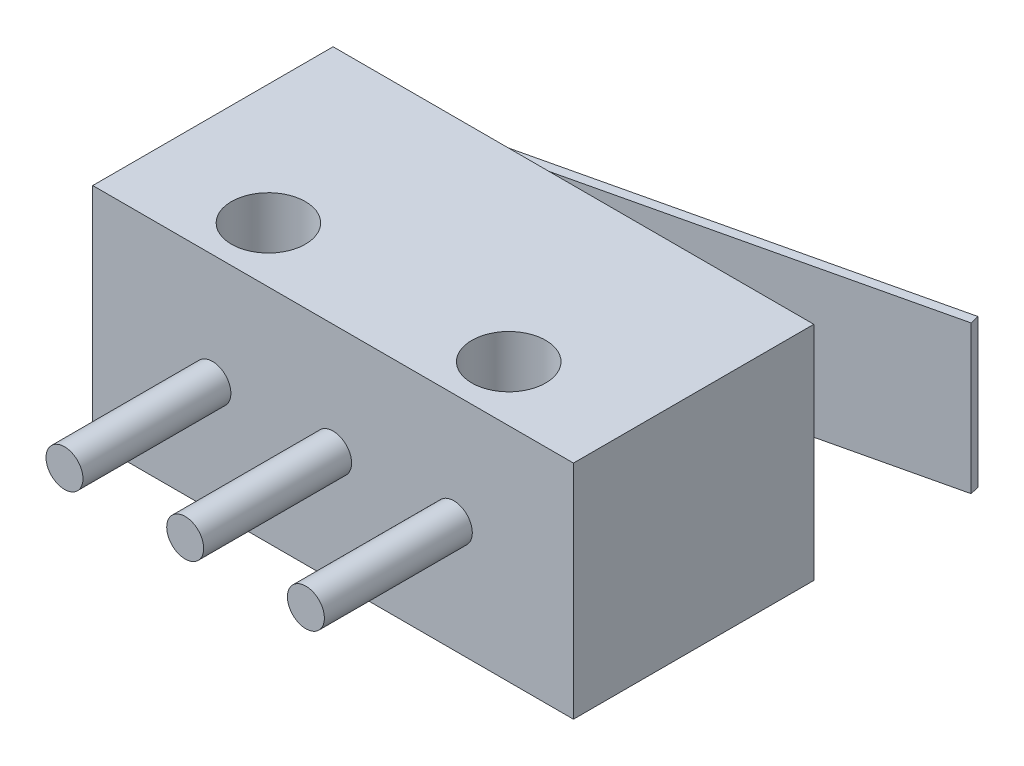
ISO-10303-21;
HEADER;
FILE_DESCRIPTION(('STEP AP214'),'2;1');
FILE_NAME('part.step','',(''),(''),'','','');
FILE_SCHEMA(('AUTOMOTIVE_DESIGN { 1 0 10303 214 1 1 1 1 }'));
ENDSEC;
DATA;
#1=APPLICATION_CONTEXT('core data for automotive mechanical design processes');
#2=APPLICATION_PROTOCOL_DEFINITION('international standard','automotive_design',2000,#1);
#3=PRODUCT_CONTEXT('',#1,'mechanical');
#4=PRODUCT('Part','Part','',(#3));
#5=PRODUCT_RELATED_PRODUCT_CATEGORY('part','',(#4));
#6=PRODUCT_DEFINITION_FORMATION('','',#4);
#7=PRODUCT_DEFINITION_CONTEXT('part definition',#1,'design');
#8=PRODUCT_DEFINITION('design','',#6,#7);
#9=PRODUCT_DEFINITION_SHAPE('','',#8);
#10=(LENGTH_UNIT() NAMED_UNIT(*) SI_UNIT(.MILLI.,.METRE.));
#11=(NAMED_UNIT(*) PLANE_ANGLE_UNIT() SI_UNIT($,.RADIAN.));
#12=(NAMED_UNIT(*) SI_UNIT($,.STERADIAN.) SOLID_ANGLE_UNIT());
#13=UNCERTAINTY_MEASURE_WITH_UNIT(LENGTH_MEASURE(1.E-05),#10,'distance_accuracy_value','');
#14=(GEOMETRIC_REPRESENTATION_CONTEXT(3) GLOBAL_UNCERTAINTY_ASSIGNED_CONTEXT((#13)) GLOBAL_UNIT_ASSIGNED_CONTEXT((#10,
#11,#12)) REPRESENTATION_CONTEXT('',''));
#15=CARTESIAN_POINT('',(0.,0.,0.));
#16=DIRECTION('',(0.,0.,1.));
#17=DIRECTION('',(1.,0.,0.));
#18=AXIS2_PLACEMENT_3D('',#15,#16,#17);
#19=CARTESIAN_POINT('',(6.5,3.,-3.25));
#20=DIRECTION('',(0.,0.,1.));
#21=DIRECTION('',(1.,0.,0.));
#22=AXIS2_PLACEMENT_3D('',#19,#20,#21);
#23=PLANE('',#22);
#24=DIRECTION('',(1.,0.,0.));
#25=VECTOR('',#24,1.);
#26=CARTESIAN_POINT('',(6.5,2.,-3.25));
#27=LINE('',#26,#25);
#28=CARTESIAN_POINT('',(-6.5,2.,-3.25));
#29=VERTEX_POINT('',#28);
#30=CARTESIAN_POINT('',(-5.94964245239629,2.,-3.25));
#31=VERTEX_POINT('',#30);
#32=EDGE_CURVE('E11',#29,#31,#27,.T.);
#33=ORIENTED_EDGE('',*,*,#32,.F.);
#34=DIRECTION('',(0.,-1.,0.));
#35=VECTOR('',#34,1.);
#36=CARTESIAN_POINT('',(-6.5,3.,-3.25));
#37=LINE('',#36,#35);
#38=CARTESIAN_POINT('',(-6.5,3.,-3.25));
#39=VERTEX_POINT('',#38);
#40=EDGE_CURVE('E189',#39,#29,#37,.T.);
#41=ORIENTED_EDGE('',*,*,#40,.F.);
#42=DIRECTION('',(-1.,0.,0.));
#43=VECTOR('',#42,1.);
#44=CARTESIAN_POINT('',(6.5,3.,-3.25));
#45=LINE('',#44,#43);
#46=CARTESIAN_POINT('',(6.5,3.,-3.25));
#47=VERTEX_POINT('',#46);
#48=EDGE_CURVE('E59',#47,#39,#45,.T.);
#49=ORIENTED_EDGE('',*,*,#48,.F.);
#50=DIRECTION('',(0.,-1.,0.));
#51=VECTOR('',#50,1.);
#52=CARTESIAN_POINT('',(6.5,3.,-3.25));
#53=LINE('',#52,#51);
#54=CARTESIAN_POINT('',(6.5,-3.,-3.25));
#55=VERTEX_POINT('',#54);
#56=EDGE_CURVE('E192',#47,#55,#53,.T.);
#57=ORIENTED_EDGE('',*,*,#56,.T.);
#58=DIRECTION('',(-1.,0.,0.));
#59=VECTOR('',#58,1.);
#60=CARTESIAN_POINT('',(6.5,-3.,-3.25));
#61=LINE('',#60,#59);
#62=CARTESIAN_POINT('',(-6.5,-3.,-3.25));
#63=VERTEX_POINT('',#62);
#64=EDGE_CURVE('E178',#55,#63,#61,.T.);
#65=ORIENTED_EDGE('',*,*,#64,.T.);
#66=CARTESIAN_POINT('',(-6.5,-2.,-3.25));
#67=VERTEX_POINT('',#66);
#68=EDGE_CURVE('E81',#67,#63,#37,.T.);
#69=ORIENTED_EDGE('',*,*,#68,.F.);
#70=DIRECTION('',(1.,0.,0.));
#71=VECTOR('',#70,1.);
#72=CARTESIAN_POINT('',(6.5,-2.,-3.25));
#73=LINE('',#72,#71);
#74=CARTESIAN_POINT('',(-5.94964245239629,-2.,-3.25));
#75=VERTEX_POINT('',#74);
#76=EDGE_CURVE('E210',#67,#75,#73,.T.);
#77=ORIENTED_EDGE('',*,*,#76,.T.);
#78=DIRECTION('',(0.,-1.,0.));
#79=VECTOR('',#78,1.);
#80=CARTESIAN_POINT('',(-5.94964245239629,3.,-3.25));
#81=LINE('',#80,#79);
#82=EDGE_CURVE('E43',#31,#75,#81,.T.);
#83=ORIENTED_EDGE('',*,*,#82,.F.);
#84=EDGE_LOOP('',(#33,#41,#49,#57,#65,#69,#77,#83));
#85=FACE_BOUND('',#84,.T.);
#86=ADVANCED_FACE('F35',(#85),#23,.F.);
#87=CARTESIAN_POINT('',(0.,3.,0.));
#88=DIRECTION('',(0.,1.,0.));
#89=DIRECTION('',(0.,0.,1.));
#90=AXIS2_PLACEMENT_3D('',#87,#88,#89);
#91=PLANE('',#90);
#92=CARTESIAN_POINT('',(3.25,3.,1.75));
#93=DIRECTION('',(0.,1.,0.));
#94=DIRECTION('',(0.,0.,1.));
#95=AXIS2_PLACEMENT_3D('',#92,#93,#94);
#96=CIRCLE('',#95,1.);
#97=CARTESIAN_POINT('',(3.25,3.,2.75));
#98=VERTEX_POINT('',#97);
#99=EDGE_CURVE('E170',#98,#98,#96,.T.);
#100=ORIENTED_EDGE('',*,*,#99,.F.);
#101=EDGE_LOOP('',(#100));
#102=FACE_BOUND('',#101,.T.);
#103=DIRECTION('',(0.,0.,1.));
#104=VECTOR('',#103,1.);
#105=CARTESIAN_POINT('',(-6.5,3.,3.25));
#106=LINE('',#105,#104);
#107=CARTESIAN_POINT('',(-6.5,3.,3.25));
#108=VERTEX_POINT('',#107);
#109=EDGE_CURVE('E176',#39,#108,#106,.T.);
#110=ORIENTED_EDGE('',*,*,#109,.T.);
#111=DIRECTION('',(1.,0.,0.));
#112=VECTOR('',#111,1.);
#113=CARTESIAN_POINT('',(6.5,3.,3.25));
#114=LINE('',#113,#112);
#115=CARTESIAN_POINT('',(6.5,3.,3.25));
#116=VERTEX_POINT('',#115);
#117=EDGE_CURVE('E89',#108,#116,#114,.T.);
#118=ORIENTED_EDGE('',*,*,#117,.T.);
#119=DIRECTION('',(0.,0.,-1.));
#120=VECTOR('',#119,1.);
#121=CARTESIAN_POINT('',(6.5,3.,3.25));
#122=LINE('',#121,#120);
#123=EDGE_CURVE('E180',#116,#47,#122,.T.);
#124=ORIENTED_EDGE('',*,*,#123,.T.);
#125=ORIENTED_EDGE('',*,*,#48,.T.);
#126=EDGE_LOOP('',(#110,#118,#124,#125));
#127=FACE_BOUND('',#126,.T.);
#128=CARTESIAN_POINT('',(-3.25,3.,1.75));
#129=DIRECTION('',(0.,1.,0.));
#130=DIRECTION('',(0.,0.,-1.));
#131=AXIS2_PLACEMENT_3D('',#128,#129,#130);
#132=CIRCLE('',#131,0.999999999999999);
#133=CARTESIAN_POINT('',(-3.25,3.,0.750000000000001));
#134=VERTEX_POINT('',#133);
#135=EDGE_CURVE('E164',#134,#134,#132,.T.);
#136=ORIENTED_EDGE('',*,*,#135,.F.);
#137=EDGE_LOOP('',(#136));
#138=FACE_BOUND('',#137,.T.);
#139=ADVANCED_FACE('F223',(#102,#127,#138),#91,.T.);
#140=CARTESIAN_POINT('',(0.,-3.,0.));
#141=DIRECTION('',(0.,1.,0.));
#142=DIRECTION('',(0.,0.,1.));
#143=AXIS2_PLACEMENT_3D('',#140,#141,#142);
#144=PLANE('',#143);
#145=DIRECTION('',(0.,0.,1.));
#146=VECTOR('',#145,1.);
#147=CARTESIAN_POINT('',(-6.5,-3.,3.25));
#148=LINE('',#147,#146);
#149=CARTESIAN_POINT('',(-6.5,-3.,3.25));
#150=VERTEX_POINT('',#149);
#151=EDGE_CURVE('E173',#63,#150,#148,.T.);
#152=ORIENTED_EDGE('',*,*,#151,.F.);
#153=ORIENTED_EDGE('',*,*,#64,.F.);
#154=DIRECTION('',(0.,0.,-1.));
#155=VECTOR('',#154,1.);
#156=CARTESIAN_POINT('',(6.5,-3.,3.25));
#157=LINE('',#156,#155);
#158=CARTESIAN_POINT('',(6.5,-3.,3.25));
#159=VERTEX_POINT('',#158);
#160=EDGE_CURVE('E186',#159,#55,#157,.T.);
#161=ORIENTED_EDGE('',*,*,#160,.F.);
#162=DIRECTION('',(1.,0.,0.));
#163=VECTOR('',#162,1.);
#164=CARTESIAN_POINT('',(6.5,-3.,3.25));
#165=LINE('',#164,#163);
#166=EDGE_CURVE('E184',#150,#159,#165,.T.);
#167=ORIENTED_EDGE('',*,*,#166,.F.);
#168=EDGE_LOOP('',(#152,#153,#161,#167));
#169=FACE_BOUND('',#168,.T.);
#170=CARTESIAN_POINT('',(3.25,-3.,1.75));
#171=DIRECTION('',(0.,1.,0.));
#172=DIRECTION('',(0.,0.,1.));
#173=AXIS2_PLACEMENT_3D('',#170,#171,#172);
#174=CIRCLE('',#173,1.);
#175=CARTESIAN_POINT('',(3.25,-3.,2.75));
#176=VERTEX_POINT('',#175);
#177=EDGE_CURVE('E167',#176,#176,#174,.T.);
#178=ORIENTED_EDGE('',*,*,#177,.T.);
#179=EDGE_LOOP('',(#178));
#180=FACE_BOUND('',#179,.T.);
#181=CARTESIAN_POINT('',(-3.25,-3.,1.75));
#182=DIRECTION('',(0.,1.,0.));
#183=DIRECTION('',(0.,0.,-1.));
#184=AXIS2_PLACEMENT_3D('',#181,#182,#183);
#185=CIRCLE('',#184,0.999999999999999);
#186=CARTESIAN_POINT('',(-3.25,-3.,0.750000000000001));
#187=VERTEX_POINT('',#186);
#188=EDGE_CURVE('E163',#187,#187,#185,.T.);
#189=ORIENTED_EDGE('',*,*,#188,.T.);
#190=EDGE_LOOP('',(#189));
#191=FACE_BOUND('',#190,.T.);
#192=ADVANCED_FACE('F234',(#169,#180,#191),#144,.F.);
#193=CARTESIAN_POINT('',(-6.5,3.,3.25));
#194=DIRECTION('',(1.,0.,0.));
#195=DIRECTION('',(0.,0.,-1.));
#196=AXIS2_PLACEMENT_3D('',#193,#194,#195);
#197=PLANE('',#196);
#198=ORIENTED_EDGE('',*,*,#151,.T.);
#199=DIRECTION('',(0.,-1.,0.));
#200=VECTOR('',#199,1.);
#201=CARTESIAN_POINT('',(-6.5,3.,3.25));
#202=LINE('',#201,#200);
#203=EDGE_CURVE('E199',#108,#150,#202,.T.);
#204=ORIENTED_EDGE('',*,*,#203,.F.);
#205=ORIENTED_EDGE('',*,*,#109,.F.);
#206=ORIENTED_EDGE('',*,*,#40,.T.);
#207=EDGE_CURVE('E193',#29,#67,#37,.T.);
#208=ORIENTED_EDGE('',*,*,#207,.T.);
#209=ORIENTED_EDGE('',*,*,#68,.T.);
#210=EDGE_LOOP('',(#198,#204,#205,#206,#208,#209));
#211=FACE_BOUND('',#210,.T.);
#212=ADVANCED_FACE('F37',(#211),#197,.F.);
#213=CARTESIAN_POINT('',(6.5,3.,3.25));
#214=DIRECTION('',(0.,0.,-1.));
#215=DIRECTION('',(-1.,0.,0.));
#216=AXIS2_PLACEMENT_3D('',#213,#214,#215);
#217=PLANE('',#216);
#218=CARTESIAN_POINT('',(3.26422794757925,0.,3.25));
#219=DIRECTION('',(0.,0.,-1.));
#220=DIRECTION('',(-1.,0.,0.));
#221=AXIS2_PLACEMENT_3D('',#218,#219,#220);
#222=CIRCLE('',#221,0.5);
#223=CARTESIAN_POINT('',(2.76422794757925,0.,3.25));
#224=VERTEX_POINT('',#223);
#225=EDGE_CURVE('E207',#224,#224,#222,.F.);
#226=ORIENTED_EDGE('',*,*,#225,.F.);
#227=EDGE_LOOP('',(#226));
#228=FACE_BOUND('',#227,.T.);
#229=CARTESIAN_POINT('',(0.,0.,3.25));
#230=DIRECTION('',(0.,0.,-1.));
#231=DIRECTION('',(-1.,0.,0.));
#232=AXIS2_PLACEMENT_3D('',#229,#230,#231);
#233=CIRCLE('',#232,0.5);
#234=CARTESIAN_POINT('',(-0.499999999999999,0.,3.25));
#235=VERTEX_POINT('',#234);
#236=EDGE_CURVE('E204',#235,#235,#233,.F.);
#237=ORIENTED_EDGE('',*,*,#236,.F.);
#238=EDGE_LOOP('',(#237));
#239=FACE_BOUND('',#238,.T.);
#240=CARTESIAN_POINT('',(-3.26422794757924,0.,3.25));
#241=DIRECTION('',(0.,0.,-1.));
#242=DIRECTION('',(-1.,0.,0.));
#243=AXIS2_PLACEMENT_3D('',#240,#241,#242);
#244=CIRCLE('',#243,0.5);
#245=CARTESIAN_POINT('',(-3.76422794757924,0.,3.25));
#246=VERTEX_POINT('',#245);
#247=EDGE_CURVE('E201',#246,#246,#244,.F.);
#248=ORIENTED_EDGE('',*,*,#247,.F.);
#249=EDGE_LOOP('',(#248));
#250=FACE_BOUND('',#249,.T.);
#251=ORIENTED_EDGE('',*,*,#166,.T.);
#252=DIRECTION('',(0.,-1.,0.));
#253=VECTOR('',#252,1.);
#254=CARTESIAN_POINT('',(6.5,3.,3.25));
#255=LINE('',#254,#253);
#256=EDGE_CURVE('E196',#116,#159,#255,.T.);
#257=ORIENTED_EDGE('',*,*,#256,.F.);
#258=ORIENTED_EDGE('',*,*,#117,.F.);
#259=ORIENTED_EDGE('',*,*,#203,.T.);
#260=EDGE_LOOP('',(#251,#257,#258,#259));
#261=FACE_BOUND('',#260,.T.);
#262=ADVANCED_FACE('F227',(#228,#239,#250,#261),#217,.F.);
#263=CARTESIAN_POINT('',(6.5,3.,3.25));
#264=DIRECTION('',(-1.,0.,0.));
#265=DIRECTION('',(0.,0.,1.));
#266=AXIS2_PLACEMENT_3D('',#263,#264,#265);
#267=PLANE('',#266);
#268=ORIENTED_EDGE('',*,*,#160,.T.);
#269=ORIENTED_EDGE('',*,*,#56,.F.);
#270=ORIENTED_EDGE('',*,*,#123,.F.);
#271=ORIENTED_EDGE('',*,*,#256,.T.);
#272=EDGE_LOOP('',(#268,#269,#270,#271));
#273=FACE_BOUND('',#272,.T.);
#274=ADVANCED_FACE('F230',(#273),#267,.F.);
#275=CARTESIAN_POINT('',(3.25,3.,1.75));
#276=DIRECTION('',(0.,-1.,0.));
#277=DIRECTION('',(0.,0.,-1.));
#278=AXIS2_PLACEMENT_3D('',#275,#276,#277);
#279=CYLINDRICAL_SURFACE('',#278,1.);
#280=ORIENTED_EDGE('',*,*,#99,.T.);
#281=EDGE_LOOP('',(#280));
#282=FACE_BOUND('',#281,.T.);
#283=ORIENTED_EDGE('',*,*,#177,.F.);
#284=EDGE_LOOP('',(#283));
#285=FACE_BOUND('',#284,.T.);
#286=ADVANCED_FACE('F245',(#282,#285),#279,.F.);
#287=CARTESIAN_POINT('',(-3.25,3.,1.75));
#288=DIRECTION('',(0.,-1.,0.));
#289=DIRECTION('',(0.,0.,-1.));
#290=AXIS2_PLACEMENT_3D('',#287,#288,#289);
#291=CYLINDRICAL_SURFACE('',#290,0.999999999999999);
#292=ORIENTED_EDGE('',*,*,#135,.T.);
#293=EDGE_LOOP('',(#292));
#294=FACE_BOUND('',#293,.T.);
#295=ORIENTED_EDGE('',*,*,#188,.F.);
#296=EDGE_LOOP('',(#295));
#297=FACE_BOUND('',#296,.T.);
#298=ADVANCED_FACE('F242',(#294,#297),#291,.F.);
#299=CARTESIAN_POINT('',(-3.26422794757924,0.,7.25));
#300=DIRECTION('',(0.,0.,-1.));
#301=DIRECTION('',(-1.,0.,0.));
#302=AXIS2_PLACEMENT_3D('',#299,#300,#301);
#303=CYLINDRICAL_SURFACE('',#302,0.5);
#304=CARTESIAN_POINT('',(-3.26422794757924,0.,7.25));
#305=DIRECTION('',(0.,0.,1.));
#306=DIRECTION('',(1.,0.,0.));
#307=AXIS2_PLACEMENT_3D('',#304,#305,#306);
#308=CIRCLE('',#307,0.5);
#309=CARTESIAN_POINT('',(-2.76422794757924,0.,7.25));
#310=VERTEX_POINT('',#309);
#311=EDGE_CURVE('E160',#310,#310,#308,.T.);
#312=ORIENTED_EDGE('',*,*,#311,.F.);
#313=EDGE_LOOP('',(#312));
#314=FACE_BOUND('',#313,.T.);
#315=ORIENTED_EDGE('',*,*,#247,.T.);
#316=EDGE_LOOP('',(#315));
#317=FACE_BOUND('',#316,.T.);
#318=ADVANCED_FACE('F244',(#314,#317),#303,.T.);
#319=CARTESIAN_POINT('',(-3.26422794757924,0.,7.25));
#320=DIRECTION('',(0.,0.,1.));
#321=DIRECTION('',(1.,0.,0.));
#322=AXIS2_PLACEMENT_3D('',#319,#320,#321);
#323=PLANE('',#322);
#324=ORIENTED_EDGE('',*,*,#311,.T.);
#325=EDGE_LOOP('',(#324));
#326=FACE_BOUND('',#325,.T.);
#327=ADVANCED_FACE('F252',(#326),#323,.T.);
#328=CARTESIAN_POINT('',(0.,0.,7.25));
#329=DIRECTION('',(0.,0.,-1.));
#330=DIRECTION('',(-1.,0.,0.));
#331=AXIS2_PLACEMENT_3D('',#328,#329,#330);
#332=CYLINDRICAL_SURFACE('',#331,0.5);
#333=CARTESIAN_POINT('',(0.,0.,7.25));
#334=DIRECTION('',(0.,0.,1.));
#335=DIRECTION('',(1.,0.,0.));
#336=AXIS2_PLACEMENT_3D('',#333,#334,#335);
#337=CIRCLE('',#336,0.5);
#338=CARTESIAN_POINT('',(0.500000000000001,0.,7.25));
#339=VERTEX_POINT('',#338);
#340=EDGE_CURVE('E157',#339,#339,#337,.T.);
#341=ORIENTED_EDGE('',*,*,#340,.F.);
#342=EDGE_LOOP('',(#341));
#343=FACE_BOUND('',#342,.T.);
#344=ORIENTED_EDGE('',*,*,#236,.T.);
#345=EDGE_LOOP('',(#344));
#346=FACE_BOUND('',#345,.T.);
#347=ADVANCED_FACE('F278',(#343,#346),#332,.T.);
#348=CARTESIAN_POINT('',(0.,0.,7.25));
#349=DIRECTION('',(0.,0.,1.));
#350=DIRECTION('',(1.,0.,0.));
#351=AXIS2_PLACEMENT_3D('',#348,#349,#350);
#352=PLANE('',#351);
#353=ORIENTED_EDGE('',*,*,#340,.T.);
#354=EDGE_LOOP('',(#353));
#355=FACE_BOUND('',#354,.T.);
#356=ADVANCED_FACE('F280',(#355),#352,.T.);
#357=CARTESIAN_POINT('',(3.26422794757925,0.,7.25));
#358=DIRECTION('',(0.,0.,-1.));
#359=DIRECTION('',(-1.,0.,0.));
#360=AXIS2_PLACEMENT_3D('',#357,#358,#359);
#361=CYLINDRICAL_SURFACE('',#360,0.5);
#362=CARTESIAN_POINT('',(3.26422794757925,0.,7.25));
#363=DIRECTION('',(0.,0.,1.));
#364=DIRECTION('',(-1.,0.,0.));
#365=AXIS2_PLACEMENT_3D('',#362,#363,#364);
#366=CIRCLE('',#365,0.5);
#367=CARTESIAN_POINT('',(2.76422794757925,0.,7.25));
#368=VERTEX_POINT('',#367);
#369=EDGE_CURVE('E134',#368,#368,#366,.T.);
#370=ORIENTED_EDGE('',*,*,#369,.F.);
#371=EDGE_LOOP('',(#370));
#372=FACE_BOUND('',#371,.T.);
#373=ORIENTED_EDGE('',*,*,#225,.T.);
#374=EDGE_LOOP('',(#373));
#375=FACE_BOUND('',#374,.T.);
#376=ADVANCED_FACE('F287',(#372,#375),#361,.T.);
#377=CARTESIAN_POINT('',(3.26422794757925,0.,7.25));
#378=DIRECTION('',(0.,0.,-1.));
#379=DIRECTION('',(-1.,0.,0.));
#380=AXIS2_PLACEMENT_3D('',#377,#378,#379);
#381=PLANE('',#380);
#382=ORIENTED_EDGE('',*,*,#369,.T.);
#383=EDGE_LOOP('',(#382));
#384=FACE_BOUND('',#383,.T.);
#385=ADVANCED_FACE('F296',(#384),#381,.F.);
#386=CARTESIAN_POINT('',(-6.47160936546063,2.,-3.12826680045915));
#387=DIRECTION('',(-0.22712507631495,0.,-0.973865596326787));
#388=DIRECTION('',(-0.973865596326787,0.,0.22712507631495));
#389=AXIS2_PLACEMENT_3D('',#386,#387,#388);
#390=PLANE('',#389);
#391=DIRECTION('',(0.973865596326787,0.,-0.22712507631495));
#392=VECTOR('',#391,1.);
#393=CARTESIAN_POINT('',(-6.47160936546063,2.,-3.12826680045915));
#394=LINE('',#393,#392);
#395=CARTESIAN_POINT('',(7.59463859730728,2.,-6.40879920047283));
#396=VERTEX_POINT('',#395);
#397=EDGE_CURVE('E116',#31,#396,#394,.T.);
#398=ORIENTED_EDGE('',*,*,#397,.F.);
#399=ORIENTED_EDGE('',*,*,#82,.T.);
#400=DIRECTION('',(0.973865596326787,0.,-0.22712507631495));
#401=VECTOR('',#400,1.);
#402=CARTESIAN_POINT('',(-6.47160936546063,-2.,-3.12826680045915));
#403=LINE('',#402,#401);
#404=CARTESIAN_POINT('',(7.59463859730728,-2.,-6.40879920047283));
#405=VERTEX_POINT('',#404);
#406=EDGE_CURVE('E50',#75,#405,#403,.T.);
#407=ORIENTED_EDGE('',*,*,#406,.T.);
#408=DIRECTION('',(0.,-1.,0.));
#409=VECTOR('',#408,1.);
#410=CARTESIAN_POINT('',(7.59463859730728,2.,-6.40879920047283));
#411=LINE('',#410,#409);
#412=EDGE_CURVE('E130',#396,#405,#411,.T.);
#413=ORIENTED_EDGE('',*,*,#412,.F.);
#414=EDGE_LOOP('',(#398,#399,#407,#413));
#415=FACE_BOUND('',#414,.T.);
#416=ADVANCED_FACE('F131',(#415),#390,.F.);
#417=CARTESIAN_POINT('',(-6.47160936546063,2.,-3.12826680045915));
#418=DIRECTION('',(-0.973865596326787,0.,0.227125076314949));
#419=DIRECTION('',(0.227125076314949,0.,0.973865596326787));
#420=AXIS2_PLACEMENT_3D('',#417,#418,#419);
#421=PLANE('',#420);
#422=ORIENTED_EDGE('',*,*,#207,.F.);
#423=DIRECTION('',(-0.227125076314949,0.,-0.973865596326787));
#424=VECTOR('',#423,1.);
#425=CARTESIAN_POINT('',(-6.47160936546063,2.,-3.12826680045915));
#426=LINE('',#425,#424);
#427=CARTESIAN_POINT('',(-6.52839063453937,2.,-3.37173319954085));
#428=VERTEX_POINT('',#427);
#429=EDGE_CURVE('E140',#29,#428,#426,.T.);
#430=ORIENTED_EDGE('',*,*,#429,.T.);
#431=DIRECTION('',(0.,-1.,0.));
#432=VECTOR('',#431,1.);
#433=CARTESIAN_POINT('',(-6.52839063453937,2.,-3.37173319954085));
#434=LINE('',#433,#432);
#435=CARTESIAN_POINT('',(-6.52839063453937,-2.,-3.37173319954085));
#436=VERTEX_POINT('',#435);
#437=EDGE_CURVE('E144',#428,#436,#434,.T.);
#438=ORIENTED_EDGE('',*,*,#437,.T.);
#439=DIRECTION('',(-0.227125076314949,0.,-0.973865596326787));
#440=VECTOR('',#439,1.);
#441=CARTESIAN_POINT('',(-6.47160936546063,-2.,-3.12826680045915));
#442=LINE('',#441,#440);
#443=EDGE_CURVE('E127',#67,#436,#442,.T.);
#444=ORIENTED_EDGE('',*,*,#443,.F.);
#445=EDGE_LOOP('',(#422,#430,#438,#444));
#446=FACE_BOUND('',#445,.T.);
#447=ADVANCED_FACE('F216',(#446),#421,.T.);
#448=CARTESIAN_POINT('',(0.,2.,0.));
#449=DIRECTION('',(0.,-1.,0.));
#450=DIRECTION('',(-1.,0.,0.));
#451=AXIS2_PLACEMENT_3D('',#448,#449,#450);
#452=PLANE('',#451);
#453=ORIENTED_EDGE('',*,*,#429,.F.);
#454=ORIENTED_EDGE('',*,*,#32,.T.);
#455=ORIENTED_EDGE('',*,*,#397,.T.);
#456=DIRECTION('',(0.227125076314949,0.,0.973865596326787));
#457=VECTOR('',#456,1.);
#458=CARTESIAN_POINT('',(7.53785732822854,2.,-6.65226559955453));
#459=LINE('',#458,#457);
#460=CARTESIAN_POINT('',(7.53785732822854,2.,-6.65226559955453));
#461=VERTEX_POINT('',#460);
#462=EDGE_CURVE('E122',#461,#396,#459,.T.);
#463=ORIENTED_EDGE('',*,*,#462,.F.);
#464=DIRECTION('',(0.973865596326787,0.,-0.22712507631495));
#465=VECTOR('',#464,1.);
#466=CARTESIAN_POINT('',(-6.52839063453937,2.,-3.37173319954085));
#467=LINE('',#466,#465);
#468=EDGE_CURVE('E138',#428,#461,#467,.T.);
#469=ORIENTED_EDGE('',*,*,#468,.F.);
#470=EDGE_LOOP('',(#453,#454,#455,#463,#469));
#471=FACE_BOUND('',#470,.T.);
#472=ADVANCED_FACE('F119',(#471),#452,.F.);
#473=CARTESIAN_POINT('',(0.,-2.,0.));
#474=DIRECTION('',(0.,-1.,0.));
#475=DIRECTION('',(-1.,0.,0.));
#476=AXIS2_PLACEMENT_3D('',#473,#474,#475);
#477=PLANE('',#476);
#478=ORIENTED_EDGE('',*,*,#76,.F.);
#479=ORIENTED_EDGE('',*,*,#443,.T.);
#480=DIRECTION('',(0.973865596326787,0.,-0.22712507631495));
#481=VECTOR('',#480,1.);
#482=CARTESIAN_POINT('',(-6.52839063453937,-2.,-3.37173319954085));
#483=LINE('',#482,#481);
#484=CARTESIAN_POINT('',(7.53785732822854,-2.,-6.65226559955453));
#485=VERTEX_POINT('',#484);
#486=EDGE_CURVE('E148',#436,#485,#483,.T.);
#487=ORIENTED_EDGE('',*,*,#486,.T.);
#488=DIRECTION('',(0.227125076314949,0.,0.973865596326787));
#489=VECTOR('',#488,1.);
#490=CARTESIAN_POINT('',(7.53785732822854,-2.,-6.65226559955453));
#491=LINE('',#490,#489);
#492=EDGE_CURVE('E146',#485,#405,#491,.T.);
#493=ORIENTED_EDGE('',*,*,#492,.T.);
#494=ORIENTED_EDGE('',*,*,#406,.F.);
#495=EDGE_LOOP('',(#478,#479,#487,#493,#494));
#496=FACE_BOUND('',#495,.T.);
#497=ADVANCED_FACE('F214',(#496),#477,.T.);
#498=CARTESIAN_POINT('',(7.53785732822854,2.,-6.65226559955453));
#499=DIRECTION('',(0.973865596326787,0.,-0.227125076314949));
#500=DIRECTION('',(-0.227125076314949,0.,-0.973865596326787));
#501=AXIS2_PLACEMENT_3D('',#498,#499,#500);
#502=PLANE('',#501);
#503=ORIENTED_EDGE('',*,*,#492,.F.);
#504=DIRECTION('',(0.,-1.,0.));
#505=VECTOR('',#504,1.);
#506=CARTESIAN_POINT('',(7.53785732822854,2.,-6.65226559955453));
#507=LINE('',#506,#505);
#508=EDGE_CURVE('E135',#461,#485,#507,.T.);
#509=ORIENTED_EDGE('',*,*,#508,.F.);
#510=ORIENTED_EDGE('',*,*,#462,.T.);
#511=ORIENTED_EDGE('',*,*,#412,.T.);
#512=EDGE_LOOP('',(#503,#509,#510,#511));
#513=FACE_BOUND('',#512,.T.);
#514=ADVANCED_FACE('F137',(#513),#502,.T.);
#515=CARTESIAN_POINT('',(-6.52839063453937,2.,-3.37173319954085));
#516=DIRECTION('',(-0.22712507631495,0.,-0.973865596326787));
#517=DIRECTION('',(-0.973865596326787,0.,0.22712507631495));
#518=AXIS2_PLACEMENT_3D('',#515,#516,#517);
#519=PLANE('',#518);
#520=ORIENTED_EDGE('',*,*,#486,.F.);
#521=ORIENTED_EDGE('',*,*,#437,.F.);
#522=ORIENTED_EDGE('',*,*,#468,.T.);
#523=ORIENTED_EDGE('',*,*,#508,.T.);
#524=EDGE_LOOP('',(#520,#521,#522,#523));
#525=FACE_BOUND('',#524,.T.);
#526=ADVANCED_FACE('F220',(#525),#519,.T.);
#527=CLOSED_SHELL('',(#86,#139,#192,#212,#262,#274,#286,#298,#318,#327,#347,#356,#376,#385,#416,
#447,#472,#497,#514,#526));
#528=MANIFOLD_SOLID_BREP('B2',#527);
#529=ADVANCED_BREP_SHAPE_REPRESENTATION('',(#18,#528),#14);
#530=SHAPE_DEFINITION_REPRESENTATION(#9,#529);
ENDSEC;
END-ISO-10303-21;
